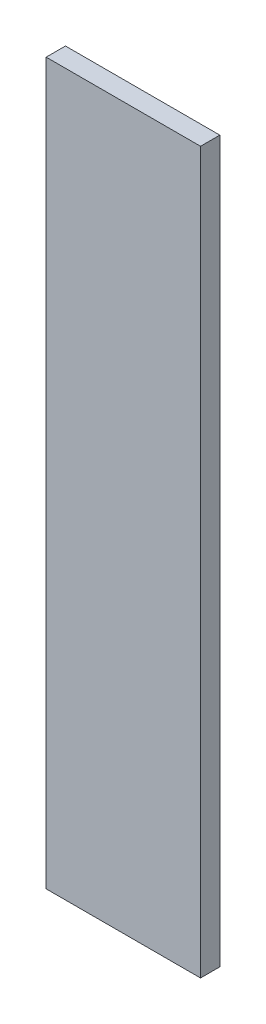
ISO-10303-21;
HEADER;
FILE_DESCRIPTION(('STEP AP214'),'2;1');
FILE_NAME('part.step','',(''),(''),'','','');
FILE_SCHEMA(('AUTOMOTIVE_DESIGN { 1 0 10303 214 1 1 1 1 }'));
ENDSEC;
DATA;
#1=APPLICATION_CONTEXT('core data for automotive mechanical design processes');
#2=APPLICATION_PROTOCOL_DEFINITION('international standard','automotive_design',2000,#1);
#3=PRODUCT_CONTEXT('',#1,'mechanical');
#4=PRODUCT('Part','Part','',(#3));
#5=PRODUCT_RELATED_PRODUCT_CATEGORY('part','',(#4));
#6=PRODUCT_DEFINITION_FORMATION('','',#4);
#7=PRODUCT_DEFINITION_CONTEXT('part definition',#1,'design');
#8=PRODUCT_DEFINITION('design','',#6,#7);
#9=PRODUCT_DEFINITION_SHAPE('','',#8);
#10=(LENGTH_UNIT() NAMED_UNIT(*) SI_UNIT(.MILLI.,.METRE.));
#11=(NAMED_UNIT(*) PLANE_ANGLE_UNIT() SI_UNIT($,.RADIAN.));
#12=(NAMED_UNIT(*) SI_UNIT($,.STERADIAN.) SOLID_ANGLE_UNIT());
#13=UNCERTAINTY_MEASURE_WITH_UNIT(LENGTH_MEASURE(1.E-05),#10,'distance_accuracy_value','');
#14=(GEOMETRIC_REPRESENTATION_CONTEXT(3) GLOBAL_UNCERTAINTY_ASSIGNED_CONTEXT((#13)) GLOBAL_UNIT_ASSIGNED_CONTEXT((#10,
#11,#12)) REPRESENTATION_CONTEXT('',''));
#15=CARTESIAN_POINT('',(0.,0.,0.));
#16=DIRECTION('',(0.,0.,1.));
#17=DIRECTION('',(1.,0.,0.));
#18=AXIS2_PLACEMENT_3D('',#15,#16,#17);
#19=CARTESIAN_POINT('',(0.,112.,3.));
#20=DIRECTION('',(1.,0.,0.));
#21=DIRECTION('',(0.,0.,-1.));
#22=AXIS2_PLACEMENT_3D('',#19,#20,#21);
#23=PLANE('',#22);
#24=DIRECTION('',(0.,-1.,0.));
#25=VECTOR('',#24,1.);
#26=CARTESIAN_POINT('',(0.,112.,0.));
#27=LINE('',#26,#25);
#28=CARTESIAN_POINT('',(0.,112.,0.));
#29=VERTEX_POINT('',#28);
#30=CARTESIAN_POINT('',(0.,0.,0.));
#31=VERTEX_POINT('',#30);
#32=EDGE_CURVE('E102',#29,#31,#27,.T.);
#33=ORIENTED_EDGE('',*,*,#32,.T.);
#34=DIRECTION('',(0.,0.,-1.));
#35=VECTOR('',#34,1.);
#36=CARTESIAN_POINT('',(0.,0.,3.));
#37=LINE('',#36,#35);
#38=CARTESIAN_POINT('',(0.,0.,3.));
#39=VERTEX_POINT('',#38);
#40=EDGE_CURVE('E11',#39,#31,#37,.T.);
#41=ORIENTED_EDGE('',*,*,#40,.F.);
#42=DIRECTION('',(0.,-1.,0.));
#43=VECTOR('',#42,1.);
#44=CARTESIAN_POINT('',(0.,112.,3.));
#45=LINE('',#44,#43);
#46=CARTESIAN_POINT('',(0.,112.,3.));
#47=VERTEX_POINT('',#46);
#48=EDGE_CURVE('E90',#47,#39,#45,.T.);
#49=ORIENTED_EDGE('',*,*,#48,.F.);
#50=DIRECTION('',(0.,0.,-1.));
#51=VECTOR('',#50,1.);
#52=CARTESIAN_POINT('',(0.,112.,3.));
#53=LINE('',#52,#51);
#54=EDGE_CURVE('E98',#47,#29,#53,.T.);
#55=ORIENTED_EDGE('',*,*,#54,.T.);
#56=EDGE_LOOP('',(#33,#41,#49,#55));
#57=FACE_BOUND('',#56,.T.);
#58=ADVANCED_FACE('F39',(#57),#23,.F.);
#59=CARTESIAN_POINT('',(0.,0.,3.));
#60=DIRECTION('',(0.,1.,0.));
#61=DIRECTION('',(0.,0.,1.));
#62=AXIS2_PLACEMENT_3D('',#59,#60,#61);
#63=PLANE('',#62);
#64=DIRECTION('',(1.,0.,0.));
#65=VECTOR('',#64,1.);
#66=CARTESIAN_POINT('',(0.,0.,0.));
#67=LINE('',#66,#65);
#68=CARTESIAN_POINT('',(24.,0.,0.));
#69=VERTEX_POINT('',#68);
#70=EDGE_CURVE('E94',#31,#69,#67,.T.);
#71=ORIENTED_EDGE('',*,*,#70,.T.);
#72=DIRECTION('',(0.,0.,-1.));
#73=VECTOR('',#72,1.);
#74=CARTESIAN_POINT('',(24.,0.,3.));
#75=LINE('',#74,#73);
#76=CARTESIAN_POINT('',(24.,0.,3.));
#77=VERTEX_POINT('',#76);
#78=EDGE_CURVE('E47',#77,#69,#75,.T.);
#79=ORIENTED_EDGE('',*,*,#78,.F.);
#80=DIRECTION('',(1.,0.,0.));
#81=VECTOR('',#80,1.);
#82=CARTESIAN_POINT('',(0.,0.,3.));
#83=LINE('',#82,#81);
#84=EDGE_CURVE('E85',#39,#77,#83,.T.);
#85=ORIENTED_EDGE('',*,*,#84,.F.);
#86=ORIENTED_EDGE('',*,*,#40,.T.);
#87=EDGE_LOOP('',(#71,#79,#85,#86));
#88=FACE_BOUND('',#87,.T.);
#89=ADVANCED_FACE('F93',(#88),#63,.F.);
#90=CARTESIAN_POINT('',(24.,0.,3.));
#91=DIRECTION('',(-1.,0.,0.));
#92=DIRECTION('',(0.,0.,1.));
#93=AXIS2_PLACEMENT_3D('',#90,#91,#92);
#94=PLANE('',#93);
#95=DIRECTION('',(0.,1.,0.));
#96=VECTOR('',#95,1.);
#97=CARTESIAN_POINT('',(24.,0.,0.));
#98=LINE('',#97,#96);
#99=CARTESIAN_POINT('',(24.,112.,0.));
#100=VERTEX_POINT('',#99);
#101=EDGE_CURVE('E72',#69,#100,#98,.T.);
#102=ORIENTED_EDGE('',*,*,#101,.T.);
#103=DIRECTION('',(0.,0.,-1.));
#104=VECTOR('',#103,1.);
#105=CARTESIAN_POINT('',(24.,112.,3.));
#106=LINE('',#105,#104);
#107=CARTESIAN_POINT('',(24.,112.,3.));
#108=VERTEX_POINT('',#107);
#109=EDGE_CURVE('E95',#108,#100,#106,.T.);
#110=ORIENTED_EDGE('',*,*,#109,.F.);
#111=DIRECTION('',(0.,1.,0.));
#112=VECTOR('',#111,1.);
#113=CARTESIAN_POINT('',(24.,0.,3.));
#114=LINE('',#113,#112);
#115=EDGE_CURVE('E88',#77,#108,#114,.T.);
#116=ORIENTED_EDGE('',*,*,#115,.F.);
#117=ORIENTED_EDGE('',*,*,#78,.T.);
#118=EDGE_LOOP('',(#102,#110,#116,#117));
#119=FACE_BOUND('',#118,.T.);
#120=ADVANCED_FACE('F96',(#119),#94,.F.);
#121=CARTESIAN_POINT('',(24.,112.,3.));
#122=DIRECTION('',(0.,-1.,0.));
#123=DIRECTION('',(0.,0.,-1.));
#124=AXIS2_PLACEMENT_3D('',#121,#122,#123);
#125=PLANE('',#124);
#126=DIRECTION('',(-1.,0.,0.));
#127=VECTOR('',#126,1.);
#128=CARTESIAN_POINT('',(24.,112.,0.));
#129=LINE('',#128,#127);
#130=EDGE_CURVE('E78',#100,#29,#129,.T.);
#131=ORIENTED_EDGE('',*,*,#130,.T.);
#132=ORIENTED_EDGE('',*,*,#54,.F.);
#133=DIRECTION('',(-1.,0.,0.));
#134=VECTOR('',#133,1.);
#135=CARTESIAN_POINT('',(24.,112.,3.));
#136=LINE('',#135,#134);
#137=EDGE_CURVE('E55',#108,#47,#136,.T.);
#138=ORIENTED_EDGE('',*,*,#137,.F.);
#139=ORIENTED_EDGE('',*,*,#109,.T.);
#140=EDGE_LOOP('',(#131,#132,#138,#139));
#141=FACE_BOUND('',#140,.T.);
#142=ADVANCED_FACE('F109',(#141),#125,.F.);
#143=CARTESIAN_POINT('',(0.,0.,3.));
#144=DIRECTION('',(0.,0.,1.));
#145=DIRECTION('',(1.,0.,0.));
#146=AXIS2_PLACEMENT_3D('',#143,#144,#145);
#147=PLANE('',#146);
#148=ORIENTED_EDGE('',*,*,#48,.T.);
#149=ORIENTED_EDGE('',*,*,#84,.T.);
#150=ORIENTED_EDGE('',*,*,#115,.T.);
#151=ORIENTED_EDGE('',*,*,#137,.T.);
#152=EDGE_LOOP('',(#148,#149,#150,#151));
#153=FACE_BOUND('',#152,.T.);
#154=ADVANCED_FACE('F86',(#153),#147,.T.);
#155=CARTESIAN_POINT('',(0.,0.,0.));
#156=DIRECTION('',(0.,0.,1.));
#157=DIRECTION('',(1.,0.,0.));
#158=AXIS2_PLACEMENT_3D('',#155,#156,#157);
#159=PLANE('',#158);
#160=ORIENTED_EDGE('',*,*,#32,.F.);
#161=ORIENTED_EDGE('',*,*,#130,.F.);
#162=ORIENTED_EDGE('',*,*,#101,.F.);
#163=ORIENTED_EDGE('',*,*,#70,.F.);
#164=EDGE_LOOP('',(#160,#161,#162,#163));
#165=FACE_BOUND('',#164,.T.);
#166=ADVANCED_FACE('F112',(#165),#159,.F.);
#167=CLOSED_SHELL('',(#58,#89,#120,#142,#154,#166));
#168=MANIFOLD_SOLID_BREP('B2',#167);
#169=ADVANCED_BREP_SHAPE_REPRESENTATION('',(#18,#168),#14);
#170=SHAPE_DEFINITION_REPRESENTATION(#9,#169);
ENDSEC;
END-ISO-10303-21;
